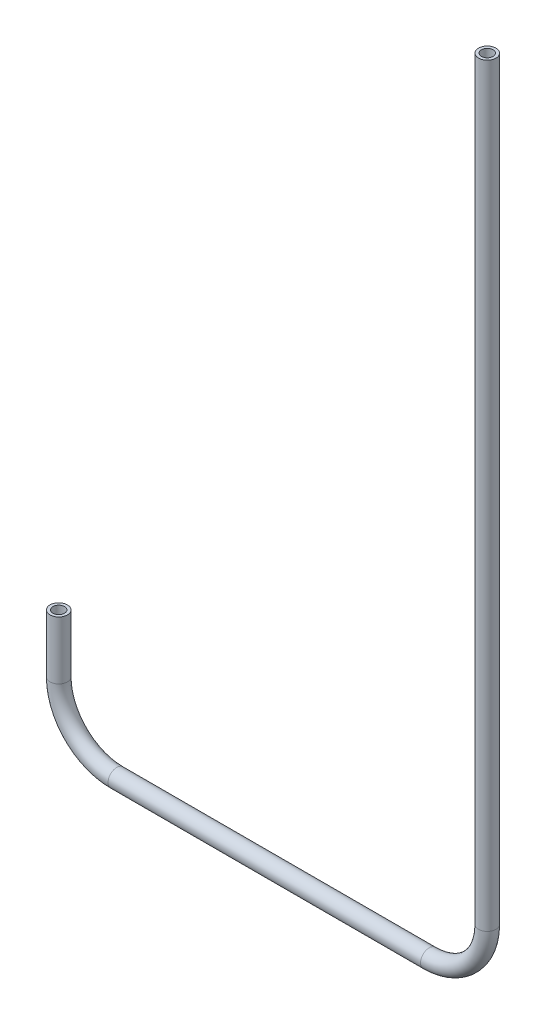
ISO-10303-21;
HEADER;
FILE_DESCRIPTION(('STEP AP214'),'2;1');
FILE_NAME('part.step','',(''),(''),'','','');
FILE_SCHEMA(('AUTOMOTIVE_DESIGN { 1 0 10303 214 1 1 1 1 }'));
ENDSEC;
DATA;
#1=APPLICATION_CONTEXT('core data for automotive mechanical design processes');
#2=APPLICATION_PROTOCOL_DEFINITION('international standard','automotive_design',2000,#1);
#3=PRODUCT_CONTEXT('',#1,'mechanical');
#4=PRODUCT('Part','Part','',(#3));
#5=PRODUCT_RELATED_PRODUCT_CATEGORY('part','',(#4));
#6=PRODUCT_DEFINITION_FORMATION('','',#4);
#7=PRODUCT_DEFINITION_CONTEXT('part definition',#1,'design');
#8=PRODUCT_DEFINITION('design','',#6,#7);
#9=PRODUCT_DEFINITION_SHAPE('','',#8);
#10=(LENGTH_UNIT() NAMED_UNIT(*) SI_UNIT(.MILLI.,.METRE.));
#11=(NAMED_UNIT(*) PLANE_ANGLE_UNIT() SI_UNIT($,.RADIAN.));
#12=(NAMED_UNIT(*) SI_UNIT($,.STERADIAN.) SOLID_ANGLE_UNIT());
#13=UNCERTAINTY_MEASURE_WITH_UNIT(LENGTH_MEASURE(1.E-05),#10,'distance_accuracy_value','');
#14=(GEOMETRIC_REPRESENTATION_CONTEXT(3) GLOBAL_UNCERTAINTY_ASSIGNED_CONTEXT((#13)) GLOBAL_UNIT_ASSIGNED_CONTEXT((#10,
#11,#12)) REPRESENTATION_CONTEXT('',''));
#15=CARTESIAN_POINT('',(0.,0.,0.));
#16=DIRECTION('',(0.,0.,1.));
#17=DIRECTION('',(1.,0.,0.));
#18=AXIS2_PLACEMENT_3D('',#15,#16,#17);
#19=CARTESIAN_POINT('',(0.,10.,0.));
#20=DIRECTION('',(0.,-1.,0.));
#21=DIRECTION('',(1.,0.,0.));
#22=AXIS2_PLACEMENT_3D('',#19,#20,#21);
#23=CYLINDRICAL_SURFACE('',#22,0.75);
#24=CARTESIAN_POINT('',(0.,5.,0.));
#25=DIRECTION('',(0.,-1.,0.));
#26=DIRECTION('',(1.,0.,0.));
#27=AXIS2_PLACEMENT_3D('',#24,#25,#26);
#28=CIRCLE('',#27,0.75);
#29=CARTESIAN_POINT('',(0.75,5.,0.));
#30=VERTEX_POINT('',#29);
#31=CARTESIAN_POINT('',(-0.75,5.,0.));
#32=VERTEX_POINT('',#31);
#33=EDGE_CURVE('E202',#30,#32,#28,.T.);
#34=ORIENTED_EDGE('',*,*,#33,.F.);
#35=CARTESIAN_POINT('',(0.,5.,0.));
#36=DIRECTION('',(0.,-1.,0.));
#37=DIRECTION('',(1.,0.,0.));
#38=AXIS2_PLACEMENT_3D('',#35,#36,#37);
#39=CIRCLE('',#38,0.75);
#40=EDGE_CURVE('E27',#32,#30,#39,.T.);
#41=ORIENTED_EDGE('',*,*,#40,.F.);
#42=DIRECTION('',(0.,1.,0.));
#43=VECTOR('',#42,1.);
#44=CARTESIAN_POINT('',(-0.75,10.,0.));
#45=LINE('',#44,#43);
#46=CARTESIAN_POINT('',(-0.75,10.,0.));
#47=VERTEX_POINT('',#46);
#48=EDGE_CURVE('E11',#32,#47,#45,.T.);
#49=ORIENTED_EDGE('',*,*,#48,.T.);
#50=CARTESIAN_POINT('',(0.,10.,0.));
#51=DIRECTION('',(0.,-1.,0.));
#52=DIRECTION('',(1.,0.,0.));
#53=AXIS2_PLACEMENT_3D('',#50,#51,#52);
#54=CIRCLE('',#53,0.75);
#55=EDGE_CURVE('E229',#47,#47,#54,.T.);
#56=ORIENTED_EDGE('',*,*,#55,.T.);
#57=ORIENTED_EDGE('',*,*,#48,.F.);
#58=EDGE_LOOP('',(#34,#41,#49,#56,#57));
#59=FACE_BOUND('',#58,.T.);
#60=ADVANCED_FACE('F17',(#59),#23,.T.);
#61=CARTESIAN_POINT('',(5.,5.,0.));
#62=DIRECTION('',(0.,0.,1.));
#63=DIRECTION('',(1.,0.,0.));
#64=AXIS2_PLACEMENT_3D('',#61,#62,#63);
#65=TOROIDAL_SURFACE('',#64,5.,0.75);
#66=CARTESIAN_POINT('',(5.,0.,0.));
#67=DIRECTION('',(1.,0.,0.));
#68=DIRECTION('',(0.,1.,0.));
#69=AXIS2_PLACEMENT_3D('',#66,#67,#68);
#70=CIRCLE('',#69,0.75);
#71=CARTESIAN_POINT('',(5.,0.75,0.));
#72=VERTEX_POINT('',#71);
#73=CARTESIAN_POINT('',(5.,-0.75,0.));
#74=VERTEX_POINT('',#73);
#75=EDGE_CURVE('E203',#72,#74,#70,.T.);
#76=ORIENTED_EDGE('',*,*,#75,.F.);
#77=CARTESIAN_POINT('',(5.,5.,0.));
#78=DIRECTION('',(0.,0.,-1.));
#79=DIRECTION('',(1.,0.,0.));
#80=AXIS2_PLACEMENT_3D('',#77,#78,#79);
#81=CIRCLE('',#80,4.25);
#82=EDGE_CURVE('E199',#72,#30,#81,.T.);
#83=ORIENTED_EDGE('',*,*,#82,.T.);
#84=ORIENTED_EDGE('',*,*,#33,.T.);
#85=ORIENTED_EDGE('',*,*,#40,.T.);
#86=ORIENTED_EDGE('',*,*,#82,.F.);
#87=CARTESIAN_POINT('',(5.,0.,0.));
#88=DIRECTION('',(1.,0.,0.));
#89=DIRECTION('',(0.,1.,0.));
#90=AXIS2_PLACEMENT_3D('',#87,#88,#89);
#91=CIRCLE('',#90,0.75);
#92=EDGE_CURVE('E219',#74,#72,#91,.T.);
#93=ORIENTED_EDGE('',*,*,#92,.F.);
#94=EDGE_LOOP('',(#76,#83,#84,#85,#86,#93));
#95=FACE_BOUND('',#94,.T.);
#96=ADVANCED_FACE('F241',(#95),#65,.T.);
#97=CARTESIAN_POINT('',(5.,0.,0.));
#98=DIRECTION('',(1.,0.,0.));
#99=DIRECTION('',(0.,1.,0.));
#100=AXIS2_PLACEMENT_3D('',#97,#98,#99);
#101=CYLINDRICAL_SURFACE('',#100,0.75);
#102=CARTESIAN_POINT('',(31.92,0.,0.));
#103=DIRECTION('',(1.,0.,0.));
#104=DIRECTION('',(0.,1.,0.));
#105=AXIS2_PLACEMENT_3D('',#102,#103,#104);
#106=CIRCLE('',#105,0.75);
#107=CARTESIAN_POINT('',(31.92,0.75,0.));
#108=VERTEX_POINT('',#107);
#109=CARTESIAN_POINT('',(31.92,-0.75,0.));
#110=VERTEX_POINT('',#109);
#111=EDGE_CURVE('E192',#108,#110,#106,.T.);
#112=ORIENTED_EDGE('',*,*,#111,.F.);
#113=CARTESIAN_POINT('',(31.92,0.,0.));
#114=DIRECTION('',(1.,0.,0.));
#115=DIRECTION('',(0.,1.,0.));
#116=AXIS2_PLACEMENT_3D('',#113,#114,#115);
#117=CIRCLE('',#116,0.75);
#118=EDGE_CURVE('E220',#110,#108,#117,.T.);
#119=ORIENTED_EDGE('',*,*,#118,.F.);
#120=DIRECTION('',(-1.,0.,0.));
#121=VECTOR('',#120,1.);
#122=CARTESIAN_POINT('',(5.,-0.75,0.));
#123=LINE('',#122,#121);
#124=EDGE_CURVE('E215',#110,#74,#123,.T.);
#125=ORIENTED_EDGE('',*,*,#124,.T.);
#126=ORIENTED_EDGE('',*,*,#92,.T.);
#127=ORIENTED_EDGE('',*,*,#75,.T.);
#128=ORIENTED_EDGE('',*,*,#124,.F.);
#129=EDGE_LOOP('',(#112,#119,#125,#126,#127,#128));
#130=FACE_BOUND('',#129,.T.);
#131=ADVANCED_FACE('F239',(#130),#101,.T.);
#132=CARTESIAN_POINT('',(31.92,5.,0.));
#133=DIRECTION('',(0.,0.,1.));
#134=DIRECTION('',(0.,1.,0.));
#135=AXIS2_PLACEMENT_3D('',#132,#133,#134);
#136=TOROIDAL_SURFACE('',#135,5.,0.75);
#137=CARTESIAN_POINT('',(36.92,5.,0.));
#138=DIRECTION('',(0.,1.,0.));
#139=DIRECTION('',(-1.,0.,0.));
#140=AXIS2_PLACEMENT_3D('',#137,#138,#139);
#141=CIRCLE('',#140,0.75);
#142=CARTESIAN_POINT('',(36.17,5.,0.));
#143=VERTEX_POINT('',#142);
#144=CARTESIAN_POINT('',(37.67,5.,0.));
#145=VERTEX_POINT('',#144);
#146=EDGE_CURVE('E58',#143,#145,#141,.T.);
#147=ORIENTED_EDGE('',*,*,#146,.F.);
#148=CARTESIAN_POINT('',(31.92,5.,0.));
#149=DIRECTION('',(0.,0.,-1.));
#150=DIRECTION('',(0.,1.,0.));
#151=AXIS2_PLACEMENT_3D('',#148,#149,#150);
#152=CIRCLE('',#151,4.25);
#153=EDGE_CURVE('E186',#143,#108,#152,.T.);
#154=ORIENTED_EDGE('',*,*,#153,.T.);
#155=ORIENTED_EDGE('',*,*,#111,.T.);
#156=ORIENTED_EDGE('',*,*,#118,.T.);
#157=ORIENTED_EDGE('',*,*,#153,.F.);
#158=CARTESIAN_POINT('',(36.92,5.,0.));
#159=DIRECTION('',(0.,1.,0.));
#160=DIRECTION('',(-1.,0.,0.));
#161=AXIS2_PLACEMENT_3D('',#158,#159,#160);
#162=CIRCLE('',#161,0.75);
#163=EDGE_CURVE('E167',#145,#143,#162,.T.);
#164=ORIENTED_EDGE('',*,*,#163,.F.);
#165=EDGE_LOOP('',(#147,#154,#155,#156,#157,#164));
#166=FACE_BOUND('',#165,.T.);
#167=ADVANCED_FACE('F246',(#166),#136,.T.);
#168=CARTESIAN_POINT('',(36.92,5.,0.));
#169=DIRECTION('',(0.,1.,0.));
#170=DIRECTION('',(-1.,0.,0.));
#171=AXIS2_PLACEMENT_3D('',#168,#169,#170);
#172=CYLINDRICAL_SURFACE('',#171,0.75);
#173=CARTESIAN_POINT('',(36.92,70.,0.));
#174=DIRECTION('',(0.,1.,0.));
#175=DIRECTION('',(-1.,0.,0.));
#176=AXIS2_PLACEMENT_3D('',#173,#174,#175);
#177=CIRCLE('',#176,0.75);
#178=CARTESIAN_POINT('',(37.67,70.,0.));
#179=VERTEX_POINT('',#178);
#180=EDGE_CURVE('E168',#179,#179,#177,.T.);
#181=ORIENTED_EDGE('',*,*,#180,.F.);
#182=DIRECTION('',(0.,-1.,0.));
#183=VECTOR('',#182,1.);
#184=CARTESIAN_POINT('',(37.67,5.,0.));
#185=LINE('',#184,#183);
#186=EDGE_CURVE('E71',#179,#145,#185,.T.);
#187=ORIENTED_EDGE('',*,*,#186,.T.);
#188=ORIENTED_EDGE('',*,*,#163,.T.);
#189=ORIENTED_EDGE('',*,*,#146,.T.);
#190=ORIENTED_EDGE('',*,*,#186,.F.);
#191=EDGE_LOOP('',(#181,#187,#188,#189,#190));
#192=FACE_BOUND('',#191,.T.);
#193=ADVANCED_FACE('F368',(#192),#172,.T.);
#194=CARTESIAN_POINT('',(36.92,70.,0.));
#195=DIRECTION('',(0.,1.,0.));
#196=DIRECTION('',(1.,0.,0.));
#197=AXIS2_PLACEMENT_3D('',#194,#195,#196);
#198=PLANE('',#197);
#199=CARTESIAN_POINT('',(36.92,70.,0.));
#200=DIRECTION('',(0.,-1.,0.));
#201=DIRECTION('',(-1.,0.,0.));
#202=AXIS2_PLACEMENT_3D('',#199,#200,#201);
#203=CIRCLE('',#202,0.5);
#204=CARTESIAN_POINT('',(37.42,70.,0.));
#205=VERTEX_POINT('',#204);
#206=EDGE_CURVE('E183',#205,#205,#203,.T.);
#207=ORIENTED_EDGE('',*,*,#206,.T.);
#208=EDGE_LOOP('',(#207));
#209=FACE_BOUND('',#208,.T.);
#210=ORIENTED_EDGE('',*,*,#180,.T.);
#211=EDGE_LOOP('',(#210));
#212=FACE_BOUND('',#211,.T.);
#213=ADVANCED_FACE('F373',(#209,#212),#198,.T.);
#214=CARTESIAN_POINT('',(36.92,5.,0.));
#215=DIRECTION('',(0.,1.,0.));
#216=DIRECTION('',(-1.,0.,0.));
#217=AXIS2_PLACEMENT_3D('',#214,#215,#216);
#218=CYLINDRICAL_SURFACE('',#217,0.5);
#219=CARTESIAN_POINT('',(36.92,5.,0.));
#220=DIRECTION('',(0.,-1.,0.));
#221=DIRECTION('',(1.,0.,0.));
#222=AXIS2_PLACEMENT_3D('',#219,#220,#221);
#223=CIRCLE('',#222,0.5);
#224=CARTESIAN_POINT('',(37.42,5.,0.));
#225=VERTEX_POINT('',#224);
#226=CARTESIAN_POINT('',(36.42,5.,0.));
#227=VERTEX_POINT('',#226);
#228=EDGE_CURVE('E143',#225,#227,#223,.T.);
#229=ORIENTED_EDGE('',*,*,#228,.T.);
#230=CARTESIAN_POINT('',(36.92,5.,0.));
#231=DIRECTION('',(0.,-1.,0.));
#232=DIRECTION('',(1.,0.,0.));
#233=AXIS2_PLACEMENT_3D('',#230,#231,#232);
#234=CIRCLE('',#233,0.5);
#235=EDGE_CURVE('E136',#227,#225,#234,.T.);
#236=ORIENTED_EDGE('',*,*,#235,.T.);
#237=DIRECTION('',(0.,1.,0.));
#238=VECTOR('',#237,1.);
#239=CARTESIAN_POINT('',(37.42,5.,0.));
#240=LINE('',#239,#238);
#241=EDGE_CURVE('E147',#225,#205,#240,.T.);
#242=ORIENTED_EDGE('',*,*,#241,.T.);
#243=ORIENTED_EDGE('',*,*,#206,.F.);
#244=ORIENTED_EDGE('',*,*,#241,.F.);
#245=EDGE_LOOP('',(#229,#236,#242,#243,#244));
#246=FACE_BOUND('',#245,.T.);
#247=ADVANCED_FACE('F149',(#246),#218,.F.);
#248=CARTESIAN_POINT('',(31.92,5.,0.));
#249=DIRECTION('',(0.,0.,1.));
#250=DIRECTION('',(0.,1.,0.));
#251=AXIS2_PLACEMENT_3D('',#248,#249,#250);
#252=TOROIDAL_SURFACE('',#251,5.,0.5);
#253=CARTESIAN_POINT('',(31.92,0.,0.));
#254=DIRECTION('',(-1.,0.,0.));
#255=DIRECTION('',(0.,1.,0.));
#256=AXIS2_PLACEMENT_3D('',#253,#254,#255);
#257=CIRCLE('',#256,0.5);
#258=CARTESIAN_POINT('',(31.92,0.5,0.));
#259=VERTEX_POINT('',#258);
#260=CARTESIAN_POINT('',(31.92,-0.5,0.));
#261=VERTEX_POINT('',#260);
#262=EDGE_CURVE('E20',#259,#261,#257,.T.);
#263=ORIENTED_EDGE('',*,*,#262,.T.);
#264=CARTESIAN_POINT('',(31.92,0.,0.));
#265=DIRECTION('',(-1.,0.,0.));
#266=DIRECTION('',(0.,1.,0.));
#267=AXIS2_PLACEMENT_3D('',#264,#265,#266);
#268=CIRCLE('',#267,0.5);
#269=EDGE_CURVE('E153',#261,#259,#268,.T.);
#270=ORIENTED_EDGE('',*,*,#269,.T.);
#271=CARTESIAN_POINT('',(31.92,5.,0.));
#272=DIRECTION('',(0.,0.,1.));
#273=DIRECTION('',(0.,1.,0.));
#274=AXIS2_PLACEMENT_3D('',#271,#272,#273);
#275=CIRCLE('',#274,4.5);
#276=EDGE_CURVE('E141',#259,#227,#275,.T.);
#277=ORIENTED_EDGE('',*,*,#276,.T.);
#278=ORIENTED_EDGE('',*,*,#228,.F.);
#279=ORIENTED_EDGE('',*,*,#235,.F.);
#280=ORIENTED_EDGE('',*,*,#276,.F.);
#281=EDGE_LOOP('',(#263,#270,#277,#278,#279,#280));
#282=FACE_BOUND('',#281,.T.);
#283=ADVANCED_FACE('F139',(#282),#252,.F.);
#284=CARTESIAN_POINT('',(5.,0.,0.));
#285=DIRECTION('',(1.,0.,0.));
#286=DIRECTION('',(0.,1.,0.));
#287=AXIS2_PLACEMENT_3D('',#284,#285,#286);
#288=CYLINDRICAL_SURFACE('',#287,0.5);
#289=CARTESIAN_POINT('',(5.,0.,0.));
#290=DIRECTION('',(-1.,0.,0.));
#291=DIRECTION('',(0.,-1.,0.));
#292=AXIS2_PLACEMENT_3D('',#289,#290,#291);
#293=CIRCLE('',#292,0.5);
#294=CARTESIAN_POINT('',(5.,-0.5,0.));
#295=VERTEX_POINT('',#294);
#296=CARTESIAN_POINT('',(5.,0.5,0.));
#297=VERTEX_POINT('',#296);
#298=EDGE_CURVE('E174',#295,#297,#293,.T.);
#299=ORIENTED_EDGE('',*,*,#298,.T.);
#300=CARTESIAN_POINT('',(5.,0.,0.));
#301=DIRECTION('',(-1.,0.,0.));
#302=DIRECTION('',(0.,-1.,0.));
#303=AXIS2_PLACEMENT_3D('',#300,#301,#302);
#304=CIRCLE('',#303,0.5);
#305=EDGE_CURVE('E169',#297,#295,#304,.T.);
#306=ORIENTED_EDGE('',*,*,#305,.T.);
#307=DIRECTION('',(1.,0.,0.));
#308=VECTOR('',#307,1.);
#309=CARTESIAN_POINT('',(5.,-0.5,0.));
#310=LINE('',#309,#308);
#311=EDGE_CURVE('E173',#295,#261,#310,.T.);
#312=ORIENTED_EDGE('',*,*,#311,.T.);
#313=ORIENTED_EDGE('',*,*,#262,.F.);
#314=ORIENTED_EDGE('',*,*,#269,.F.);
#315=ORIENTED_EDGE('',*,*,#311,.F.);
#316=EDGE_LOOP('',(#299,#306,#312,#313,#314,#315));
#317=FACE_BOUND('',#316,.T.);
#318=ADVANCED_FACE('F269',(#317),#288,.F.);
#319=CARTESIAN_POINT('',(5.,5.,0.));
#320=DIRECTION('',(0.,0.,1.));
#321=DIRECTION('',(1.,0.,0.));
#322=AXIS2_PLACEMENT_3D('',#319,#320,#321);
#323=TOROIDAL_SURFACE('',#322,5.,0.5);
#324=CARTESIAN_POINT('',(0.,5.,0.));
#325=DIRECTION('',(0.,1.,0.));
#326=DIRECTION('',(1.,0.,0.));
#327=AXIS2_PLACEMENT_3D('',#324,#325,#326);
#328=CIRCLE('',#327,0.5);
#329=CARTESIAN_POINT('',(0.5,5.,0.));
#330=VERTEX_POINT('',#329);
#331=CARTESIAN_POINT('',(-0.5,5.,0.));
#332=VERTEX_POINT('',#331);
#333=EDGE_CURVE('E177',#330,#332,#328,.T.);
#334=ORIENTED_EDGE('',*,*,#333,.T.);
#335=CARTESIAN_POINT('',(0.,5.,0.));
#336=DIRECTION('',(0.,1.,0.));
#337=DIRECTION('',(1.,0.,0.));
#338=AXIS2_PLACEMENT_3D('',#335,#336,#337);
#339=CIRCLE('',#338,0.5);
#340=EDGE_CURVE('E111',#332,#330,#339,.T.);
#341=ORIENTED_EDGE('',*,*,#340,.T.);
#342=CARTESIAN_POINT('',(5.,5.,0.));
#343=DIRECTION('',(0.,0.,1.));
#344=DIRECTION('',(1.,0.,0.));
#345=AXIS2_PLACEMENT_3D('',#342,#343,#344);
#346=CIRCLE('',#345,4.5);
#347=EDGE_CURVE('E182',#330,#297,#346,.T.);
#348=ORIENTED_EDGE('',*,*,#347,.T.);
#349=ORIENTED_EDGE('',*,*,#298,.F.);
#350=ORIENTED_EDGE('',*,*,#305,.F.);
#351=ORIENTED_EDGE('',*,*,#347,.F.);
#352=EDGE_LOOP('',(#334,#341,#348,#349,#350,#351));
#353=FACE_BOUND('',#352,.T.);
#354=ADVANCED_FACE('F267',(#353),#323,.F.);
#355=CARTESIAN_POINT('',(0.,10.,0.));
#356=DIRECTION('',(0.,-1.,0.));
#357=DIRECTION('',(1.,0.,0.));
#358=AXIS2_PLACEMENT_3D('',#355,#356,#357);
#359=CYLINDRICAL_SURFACE('',#358,0.5);
#360=CARTESIAN_POINT('',(0.,10.,0.));
#361=DIRECTION('',(0.,1.,0.));
#362=DIRECTION('',(1.,0.,0.));
#363=AXIS2_PLACEMENT_3D('',#360,#361,#362);
#364=CIRCLE('',#363,0.5);
#365=CARTESIAN_POINT('',(-0.5,10.,0.));
#366=VERTEX_POINT('',#365);
#367=EDGE_CURVE('E178',#366,#366,#364,.T.);
#368=ORIENTED_EDGE('',*,*,#367,.T.);
#369=DIRECTION('',(0.,-1.,0.));
#370=VECTOR('',#369,1.);
#371=CARTESIAN_POINT('',(-0.5,10.,0.));
#372=LINE('',#371,#370);
#373=EDGE_CURVE('E103',#366,#332,#372,.T.);
#374=ORIENTED_EDGE('',*,*,#373,.T.);
#375=ORIENTED_EDGE('',*,*,#333,.F.);
#376=ORIENTED_EDGE('',*,*,#340,.F.);
#377=ORIENTED_EDGE('',*,*,#373,.F.);
#378=EDGE_LOOP('',(#368,#374,#375,#376,#377));
#379=FACE_BOUND('',#378,.T.);
#380=ADVANCED_FACE('F347',(#379),#359,.F.);
#381=CARTESIAN_POINT('',(0.,10.,0.));
#382=DIRECTION('',(0.,-1.,0.));
#383=DIRECTION('',(0.,0.,-1.));
#384=AXIS2_PLACEMENT_3D('',#381,#382,#383);
#385=PLANE('',#384);
#386=ORIENTED_EDGE('',*,*,#367,.F.);
#387=EDGE_LOOP('',(#386));
#388=FACE_BOUND('',#387,.T.);
#389=ORIENTED_EDGE('',*,*,#55,.F.);
#390=EDGE_LOOP('',(#389));
#391=FACE_BOUND('',#390,.T.);
#392=ADVANCED_FACE('F349',(#388,#391),#385,.F.);
#393=CLOSED_SHELL('',(#60,#96,#131,#167,#193,#213,#247,#283,#318,#354,#380,#392));
#394=MANIFOLD_SOLID_BREP('B1',#393);
#395=ADVANCED_BREP_SHAPE_REPRESENTATION('',(#18,#394),#14);
#396=SHAPE_DEFINITION_REPRESENTATION(#9,#395);
ENDSEC;
END-ISO-10303-21;
